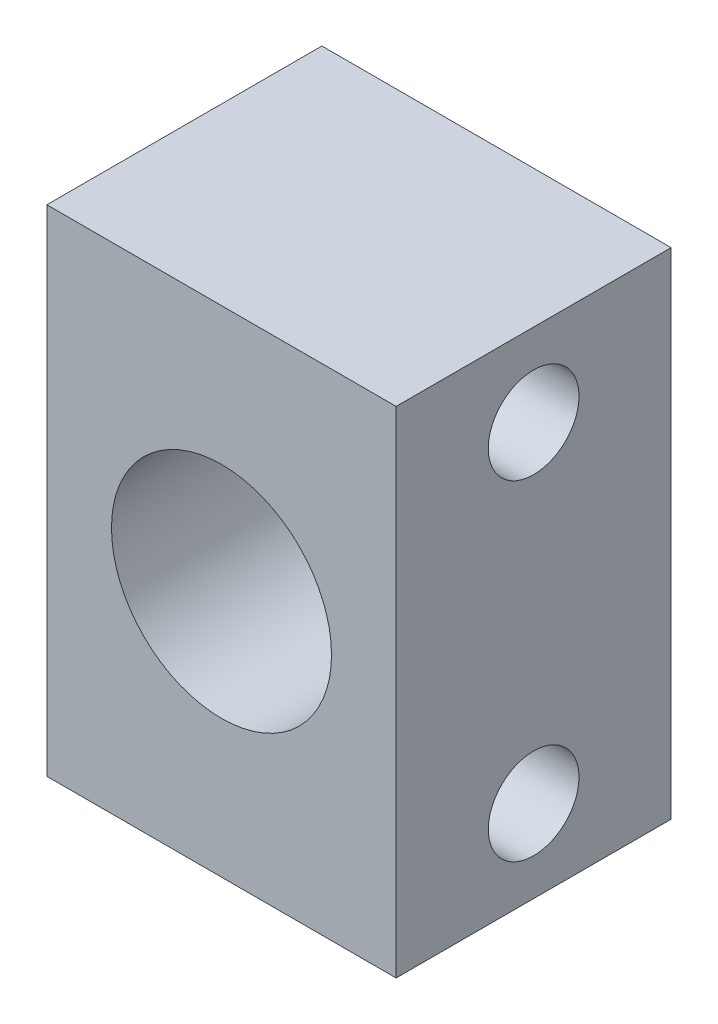
ISO-10303-21;
HEADER;
FILE_DESCRIPTION(('STEP AP214'),'2;1');
FILE_NAME('part.step','',(''),(''),'','','');
FILE_SCHEMA(('AUTOMOTIVE_DESIGN { 1 0 10303 214 1 1 1 1 }'));
ENDSEC;
DATA;
#1=APPLICATION_CONTEXT('core data for automotive mechanical design processes');
#2=APPLICATION_PROTOCOL_DEFINITION('international standard','automotive_design',2000,#1);
#3=PRODUCT_CONTEXT('',#1,'mechanical');
#4=PRODUCT('Part','Part','',(#3));
#5=PRODUCT_RELATED_PRODUCT_CATEGORY('part','',(#4));
#6=PRODUCT_DEFINITION_FORMATION('','',#4);
#7=PRODUCT_DEFINITION_CONTEXT('part definition',#1,'design');
#8=PRODUCT_DEFINITION('design','',#6,#7);
#9=PRODUCT_DEFINITION_SHAPE('','',#8);
#10=(LENGTH_UNIT() NAMED_UNIT(*) SI_UNIT(.MILLI.,.METRE.));
#11=(NAMED_UNIT(*) PLANE_ANGLE_UNIT() SI_UNIT($,.RADIAN.));
#12=(NAMED_UNIT(*) SI_UNIT($,.STERADIAN.) SOLID_ANGLE_UNIT());
#13=UNCERTAINTY_MEASURE_WITH_UNIT(LENGTH_MEASURE(1.E-05),#10,'distance_accuracy_value','');
#14=(GEOMETRIC_REPRESENTATION_CONTEXT(3) GLOBAL_UNCERTAINTY_ASSIGNED_CONTEXT((#13)) GLOBAL_UNIT_ASSIGNED_CONTEXT((#10,
#11,#12)) REPRESENTATION_CONTEXT('',''));
#15=CARTESIAN_POINT('',(0.,0.,0.));
#16=DIRECTION('',(0.,0.,1.));
#17=DIRECTION('',(1.,0.,0.));
#18=AXIS2_PLACEMENT_3D('',#15,#16,#17);
#19=CARTESIAN_POINT('',(6.35,-9.,5.));
#20=DIRECTION('',(0.,0.,-1.));
#21=DIRECTION('',(-1.,0.,0.));
#22=AXIS2_PLACEMENT_3D('',#19,#20,#21);
#23=PLANE('',#22);
#24=DIRECTION('',(0.,-1.,0.));
#25=VECTOR('',#24,1.);
#26=CARTESIAN_POINT('',(-6.35,-9.,5.));
#27=LINE('',#26,#25);
#28=CARTESIAN_POINT('',(-6.35,9.,5.));
#29=VERTEX_POINT('',#28);
#30=CARTESIAN_POINT('',(-6.35,-9.,5.));
#31=VERTEX_POINT('',#30);
#32=EDGE_CURVE('E71',#29,#31,#27,.T.);
#33=ORIENTED_EDGE('',*,*,#32,.T.);
#34=DIRECTION('',(-1.,0.,0.));
#35=VECTOR('',#34,1.);
#36=CARTESIAN_POINT('',(6.35,-9.,5.));
#37=LINE('',#36,#35);
#38=CARTESIAN_POINT('',(6.35,-9.,5.));
#39=VERTEX_POINT('',#38);
#40=EDGE_CURVE('E95',#39,#31,#37,.T.);
#41=ORIENTED_EDGE('',*,*,#40,.F.);
#42=DIRECTION('',(0.,-1.,0.));
#43=VECTOR('',#42,1.);
#44=CARTESIAN_POINT('',(6.35,-9.,5.));
#45=LINE('',#44,#43);
#46=CARTESIAN_POINT('',(6.35,9.,5.));
#47=VERTEX_POINT('',#46);
#48=EDGE_CURVE('E88',#47,#39,#45,.T.);
#49=ORIENTED_EDGE('',*,*,#48,.F.);
#50=DIRECTION('',(-1.,0.,0.));
#51=VECTOR('',#50,1.);
#52=CARTESIAN_POINT('',(6.35,9.,5.));
#53=LINE('',#52,#51);
#54=EDGE_CURVE('E46',#47,#29,#53,.T.);
#55=ORIENTED_EDGE('',*,*,#54,.T.);
#56=EDGE_LOOP('',(#33,#41,#49,#55));
#57=FACE_BOUND('',#56,.T.);
#58=CARTESIAN_POINT('',(0.,0.,5.));
#59=DIRECTION('',(0.,0.,1.));
#60=DIRECTION('',(1.,0.,0.));
#61=AXIS2_PLACEMENT_3D('',#58,#59,#60);
#62=CIRCLE('',#61,4.);
#63=CARTESIAN_POINT('',(4.,0.,5.));
#64=VERTEX_POINT('',#63);
#65=EDGE_CURVE('E130',#64,#64,#62,.T.);
#66=ORIENTED_EDGE('',*,*,#65,.F.);
#67=EDGE_LOOP('',(#66));
#68=FACE_BOUND('',#67,.T.);
#69=ADVANCED_FACE('F37',(#57,#68),#23,.F.);
#70=CARTESIAN_POINT('',(6.35,0.,0.));
#71=DIRECTION('',(-1.,0.,0.));
#72=DIRECTION('',(0.,0.,1.));
#73=AXIS2_PLACEMENT_3D('',#70,#71,#72);
#74=PLANE('',#73);
#75=CARTESIAN_POINT('',(6.35,6.,0.));
#76=DIRECTION('',(1.,0.,0.));
#77=DIRECTION('',(0.,0.,-1.));
#78=AXIS2_PLACEMENT_3D('',#75,#76,#77);
#79=CIRCLE('',#78,1.64999999999999);
#80=CARTESIAN_POINT('',(6.35,6.,-1.64999999999999));
#81=VERTEX_POINT('',#80);
#82=EDGE_CURVE('E124',#81,#81,#79,.T.);
#83=ORIENTED_EDGE('',*,*,#82,.F.);
#84=EDGE_LOOP('',(#83));
#85=FACE_BOUND('',#84,.T.);
#86=DIRECTION('',(0.,1.,0.));
#87=VECTOR('',#86,1.);
#88=CARTESIAN_POINT('',(6.35,-9.,-5.));
#89=LINE('',#88,#87);
#90=CARTESIAN_POINT('',(6.35,-9.,-5.));
#91=VERTEX_POINT('',#90);
#92=CARTESIAN_POINT('',(6.35,9.,-5.));
#93=VERTEX_POINT('',#92);
#94=EDGE_CURVE('E90',#91,#93,#89,.T.);
#95=ORIENTED_EDGE('',*,*,#94,.T.);
#96=DIRECTION('',(0.,0.,1.));
#97=VECTOR('',#96,1.);
#98=CARTESIAN_POINT('',(6.35,9.,5.));
#99=LINE('',#98,#97);
#100=EDGE_CURVE('E84',#93,#47,#99,.T.);
#101=ORIENTED_EDGE('',*,*,#100,.T.);
#102=ORIENTED_EDGE('',*,*,#48,.T.);
#103=DIRECTION('',(0.,0.,-1.));
#104=VECTOR('',#103,1.);
#105=CARTESIAN_POINT('',(6.35,-9.,5.));
#106=LINE('',#105,#104);
#107=EDGE_CURVE('E54',#39,#91,#106,.T.);
#108=ORIENTED_EDGE('',*,*,#107,.T.);
#109=EDGE_LOOP('',(#95,#101,#102,#108));
#110=FACE_BOUND('',#109,.T.);
#111=CARTESIAN_POINT('',(6.35,-6.,0.));
#112=DIRECTION('',(1.,0.,0.));
#113=DIRECTION('',(0.,0.,-1.));
#114=AXIS2_PLACEMENT_3D('',#111,#112,#113);
#115=CIRCLE('',#114,1.64999999999999);
#116=CARTESIAN_POINT('',(6.35,-6.,-1.64999999999999));
#117=VERTEX_POINT('',#116);
#118=EDGE_CURVE('E118',#117,#117,#115,.T.);
#119=ORIENTED_EDGE('',*,*,#118,.F.);
#120=EDGE_LOOP('',(#119));
#121=FACE_BOUND('',#120,.T.);
#122=ADVANCED_FACE('F85',(#85,#110,#121),#74,.F.);
#123=CARTESIAN_POINT('',(6.35,-9.,-5.));
#124=DIRECTION('',(0.,0.,1.));
#125=DIRECTION('',(1.,0.,0.));
#126=AXIS2_PLACEMENT_3D('',#123,#124,#125);
#127=PLANE('',#126);
#128=CARTESIAN_POINT('',(0.,0.,-5.));
#129=DIRECTION('',(0.,0.,1.));
#130=DIRECTION('',(1.,0.,0.));
#131=AXIS2_PLACEMENT_3D('',#128,#129,#130);
#132=CIRCLE('',#131,4.);
#133=CARTESIAN_POINT('',(4.,0.,-5.));
#134=VERTEX_POINT('',#133);
#135=EDGE_CURVE('E127',#134,#134,#132,.T.);
#136=ORIENTED_EDGE('',*,*,#135,.T.);
#137=EDGE_LOOP('',(#136));
#138=FACE_BOUND('',#137,.T.);
#139=DIRECTION('',(0.,1.,0.));
#140=VECTOR('',#139,1.);
#141=CARTESIAN_POINT('',(-6.35,-9.,-5.));
#142=LINE('',#141,#140);
#143=CARTESIAN_POINT('',(-6.35,-9.,-5.));
#144=VERTEX_POINT('',#143);
#145=CARTESIAN_POINT('',(-6.35,9.,-5.));
#146=VERTEX_POINT('',#145);
#147=EDGE_CURVE('E102',#144,#146,#142,.T.);
#148=ORIENTED_EDGE('',*,*,#147,.T.);
#149=DIRECTION('',(-1.,0.,0.));
#150=VECTOR('',#149,1.);
#151=CARTESIAN_POINT('',(6.35,9.,-5.));
#152=LINE('',#151,#150);
#153=EDGE_CURVE('E11',#93,#146,#152,.T.);
#154=ORIENTED_EDGE('',*,*,#153,.F.);
#155=ORIENTED_EDGE('',*,*,#94,.F.);
#156=DIRECTION('',(-1.,0.,0.));
#157=VECTOR('',#156,1.);
#158=CARTESIAN_POINT('',(6.35,-9.,-5.));
#159=LINE('',#158,#157);
#160=EDGE_CURVE('E98',#91,#144,#159,.T.);
#161=ORIENTED_EDGE('',*,*,#160,.T.);
#162=EDGE_LOOP('',(#148,#154,#155,#161));
#163=FACE_BOUND('',#162,.T.);
#164=ADVANCED_FACE('F39',(#138,#163),#127,.F.);
#165=CARTESIAN_POINT('',(6.35,9.,5.));
#166=DIRECTION('',(0.,-1.,0.));
#167=DIRECTION('',(0.,0.,-1.));
#168=AXIS2_PLACEMENT_3D('',#165,#166,#167);
#169=PLANE('',#168);
#170=DIRECTION('',(0.,0.,1.));
#171=VECTOR('',#170,1.);
#172=CARTESIAN_POINT('',(-6.35,9.,5.));
#173=LINE('',#172,#171);
#174=EDGE_CURVE('E94',#146,#29,#173,.T.);
#175=ORIENTED_EDGE('',*,*,#174,.T.);
#176=ORIENTED_EDGE('',*,*,#54,.F.);
#177=ORIENTED_EDGE('',*,*,#100,.F.);
#178=ORIENTED_EDGE('',*,*,#153,.T.);
#179=EDGE_LOOP('',(#175,#176,#177,#178));
#180=FACE_BOUND('',#179,.T.);
#181=ADVANCED_FACE('F93',(#180),#169,.F.);
#182=CARTESIAN_POINT('',(6.35,-9.,5.));
#183=DIRECTION('',(0.,1.,0.));
#184=DIRECTION('',(0.,0.,1.));
#185=AXIS2_PLACEMENT_3D('',#182,#183,#184);
#186=PLANE('',#185);
#187=DIRECTION('',(0.,0.,-1.));
#188=VECTOR('',#187,1.);
#189=CARTESIAN_POINT('',(-6.35,-9.,5.));
#190=LINE('',#189,#188);
#191=EDGE_CURVE('E77',#31,#144,#190,.T.);
#192=ORIENTED_EDGE('',*,*,#191,.T.);
#193=ORIENTED_EDGE('',*,*,#160,.F.);
#194=ORIENTED_EDGE('',*,*,#107,.F.);
#195=ORIENTED_EDGE('',*,*,#40,.T.);
#196=EDGE_LOOP('',(#192,#193,#194,#195));
#197=FACE_BOUND('',#196,.T.);
#198=ADVANCED_FACE('F110',(#197),#186,.F.);
#199=CARTESIAN_POINT('',(-6.35,0.,0.));
#200=DIRECTION('',(-1.,0.,0.));
#201=DIRECTION('',(0.,0.,1.));
#202=AXIS2_PLACEMENT_3D('',#199,#200,#201);
#203=PLANE('',#202);
#204=CARTESIAN_POINT('',(-6.35,6.,0.));
#205=DIRECTION('',(-1.,0.,0.));
#206=DIRECTION('',(0.,0.,1.));
#207=AXIS2_PLACEMENT_3D('',#204,#205,#206);
#208=CIRCLE('',#207,1.64999999999999);
#209=CARTESIAN_POINT('',(-6.35,6.,1.64999999999999));
#210=VERTEX_POINT('',#209);
#211=EDGE_CURVE('E121',#210,#210,#208,.T.);
#212=ORIENTED_EDGE('',*,*,#211,.F.);
#213=EDGE_LOOP('',(#212));
#214=FACE_BOUND('',#213,.T.);
#215=CARTESIAN_POINT('',(-6.35,-6.,0.));
#216=DIRECTION('',(-1.,0.,0.));
#217=DIRECTION('',(0.,0.,1.));
#218=AXIS2_PLACEMENT_3D('',#215,#216,#217);
#219=CIRCLE('',#218,1.64999999999999);
#220=CARTESIAN_POINT('',(-6.35,-6.,1.64999999999999));
#221=VERTEX_POINT('',#220);
#222=EDGE_CURVE('E105',#221,#221,#219,.T.);
#223=ORIENTED_EDGE('',*,*,#222,.F.);
#224=EDGE_LOOP('',(#223));
#225=FACE_BOUND('',#224,.T.);
#226=ORIENTED_EDGE('',*,*,#147,.F.);
#227=ORIENTED_EDGE('',*,*,#191,.F.);
#228=ORIENTED_EDGE('',*,*,#32,.F.);
#229=ORIENTED_EDGE('',*,*,#174,.F.);
#230=EDGE_LOOP('',(#226,#227,#228,#229));
#231=FACE_BOUND('',#230,.T.);
#232=ADVANCED_FACE('F113',(#214,#225,#231),#203,.T.);
#233=CARTESIAN_POINT('',(6.35,-6.,0.));
#234=DIRECTION('',(1.,0.,0.));
#235=DIRECTION('',(0.,0.,-1.));
#236=AXIS2_PLACEMENT_3D('',#233,#234,#235);
#237=CYLINDRICAL_SURFACE('',#236,1.64999999999999);
#238=ORIENTED_EDGE('',*,*,#118,.T.);
#239=EDGE_LOOP('',(#238));
#240=FACE_BOUND('',#239,.T.);
#241=ORIENTED_EDGE('',*,*,#222,.T.);
#242=EDGE_LOOP('',(#241));
#243=FACE_BOUND('',#242,.T.);
#244=ADVANCED_FACE('F160',(#240,#243),#237,.F.);
#245=CARTESIAN_POINT('',(6.35,6.,0.));
#246=DIRECTION('',(1.,0.,0.));
#247=DIRECTION('',(0.,0.,-1.));
#248=AXIS2_PLACEMENT_3D('',#245,#246,#247);
#249=CYLINDRICAL_SURFACE('',#248,1.64999999999999);
#250=ORIENTED_EDGE('',*,*,#82,.T.);
#251=EDGE_LOOP('',(#250));
#252=FACE_BOUND('',#251,.T.);
#253=ORIENTED_EDGE('',*,*,#211,.T.);
#254=EDGE_LOOP('',(#253));
#255=FACE_BOUND('',#254,.T.);
#256=ADVANCED_FACE('F155',(#252,#255),#249,.F.);
#257=CARTESIAN_POINT('',(0.,0.,5.));
#258=DIRECTION('',(0.,0.,1.));
#259=DIRECTION('',(1.,0.,0.));
#260=AXIS2_PLACEMENT_3D('',#257,#258,#259);
#261=CYLINDRICAL_SURFACE('',#260,4.);
#262=ORIENTED_EDGE('',*,*,#135,.F.);
#263=EDGE_LOOP('',(#262));
#264=FACE_BOUND('',#263,.T.);
#265=ORIENTED_EDGE('',*,*,#65,.T.);
#266=EDGE_LOOP('',(#265));
#267=FACE_BOUND('',#266,.T.);
#268=ADVANCED_FACE('F134',(#264,#267),#261,.F.);
#269=CLOSED_SHELL('',(#69,#122,#164,#181,#198,#232,#244,#256,#268));
#270=MANIFOLD_SOLID_BREP('B2',#269);
#271=ADVANCED_BREP_SHAPE_REPRESENTATION('',(#18,#270),#14);
#272=SHAPE_DEFINITION_REPRESENTATION(#9,#271);
ENDSEC;
END-ISO-10303-21;
